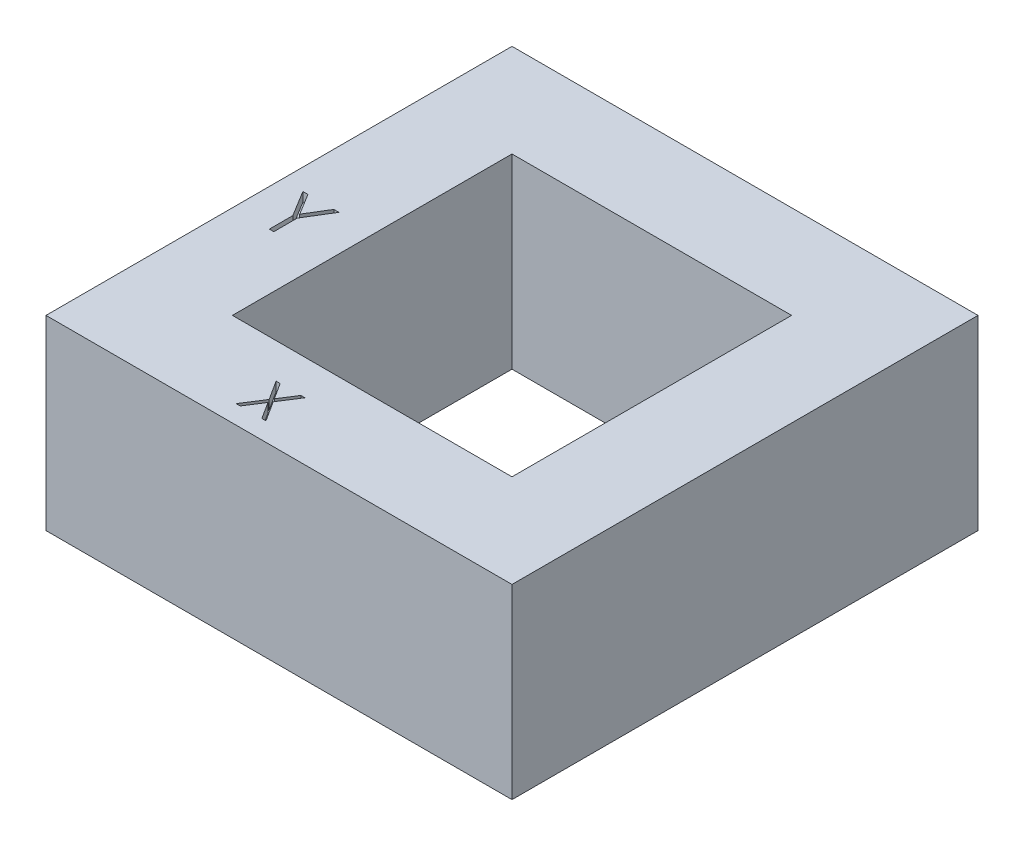
ISO-10303-21;
HEADER;
FILE_DESCRIPTION(('STEP AP214'),'2;1');
FILE_NAME('part.step','',(''),(''),'','','');
FILE_SCHEMA(('AUTOMOTIVE_DESIGN { 1 0 10303 214 1 1 1 1 }'));
ENDSEC;
DATA;
#1=APPLICATION_CONTEXT('core data for automotive mechanical design processes');
#2=APPLICATION_PROTOCOL_DEFINITION('international standard','automotive_design',2000,#1);
#3=PRODUCT_CONTEXT('',#1,'mechanical');
#4=PRODUCT('Part','Part','',(#3));
#5=PRODUCT_RELATED_PRODUCT_CATEGORY('part','',(#4));
#6=PRODUCT_DEFINITION_FORMATION('','',#4);
#7=PRODUCT_DEFINITION_CONTEXT('part definition',#1,'design');
#8=PRODUCT_DEFINITION('design','',#6,#7);
#9=PRODUCT_DEFINITION_SHAPE('','',#8);
#10=(LENGTH_UNIT() NAMED_UNIT(*) SI_UNIT(.MILLI.,.METRE.));
#11=(NAMED_UNIT(*) PLANE_ANGLE_UNIT() SI_UNIT($,.RADIAN.));
#12=(NAMED_UNIT(*) SI_UNIT($,.STERADIAN.) SOLID_ANGLE_UNIT());
#13=UNCERTAINTY_MEASURE_WITH_UNIT(LENGTH_MEASURE(1.E-05),#10,'distance_accuracy_value','');
#14=(GEOMETRIC_REPRESENTATION_CONTEXT(3) GLOBAL_UNCERTAINTY_ASSIGNED_CONTEXT((#13)) GLOBAL_UNIT_ASSIGNED_CONTEXT((#10,
#11,#12)) REPRESENTATION_CONTEXT('',''));
#15=CARTESIAN_POINT('',(0.,0.,0.));
#16=DIRECTION('',(0.,0.,1.));
#17=DIRECTION('',(1.,0.,0.));
#18=AXIS2_PLACEMENT_3D('',#15,#16,#17);
#19=CARTESIAN_POINT('',(0.,10.,0.));
#20=DIRECTION('',(0.,-1.,0.));
#21=DIRECTION('',(0.,0.,-1.));
#22=AXIS2_PLACEMENT_3D('',#19,#20,#21);
#23=PLANE('',#22);
#24=DIRECTION('',(-0.521331386880887,0.,-0.853354313900651));
#25=VECTOR('',#24,1.);
#26=CARTESIAN_POINT('',(-10.5162927350427,10.,1.24227514022436));
#27=LINE('',#26,#25);
#28=CARTESIAN_POINT('',(-10.5162927350427,10.,1.24227514022436));
#29=VERTEX_POINT('',#28);
#30=CARTESIAN_POINT('',(-11.3643162393162,10.,-0.145833333333329));
#31=VERTEX_POINT('',#30);
#32=EDGE_CURVE('E56',#29,#31,#27,.T.);
#33=ORIENTED_EDGE('',*,*,#32,.T.);
#34=DIRECTION('',(1.,0.,0.));
#35=VECTOR('',#34,1.);
#36=CARTESIAN_POINT('',(-11.3643162393162,10.,-0.145833333333329));
#37=LINE('',#36,#35);
#38=CARTESIAN_POINT('',(-11.0924187032585,10.,-0.145833333333329));
#39=VERTEX_POINT('',#38);
#40=EDGE_CURVE('E279',#31,#39,#37,.T.);
#41=ORIENTED_EDGE('',*,*,#40,.T.);
#42=DIRECTION('',(0.521787793651245,0.,0.853075318126463));
#43=VECTOR('',#42,1.);
#44=CARTESIAN_POINT('',(-11.0924187032585,10.,-0.145833333333329));
#45=LINE('',#44,#43);
#46=CARTESIAN_POINT('',(-10.3970394297543,10.,0.991048177083337));
#47=VERTEX_POINT('',#46);
#48=EDGE_CURVE('E282',#39,#47,#45,.T.);
#49=ORIENTED_EDGE('',*,*,#48,.T.);
#50=DIRECTION('',(0.521208584832579,0.,-0.853429324019757));
#51=VECTOR('',#50,1.);
#52=CARTESIAN_POINT('',(-10.3970394297543,10.,0.991048177083337));
#53=LINE('',#52,#51);
#54=CARTESIAN_POINT('',(-9.70272018563034,10.,-0.145833333333329));
#55=VERTEX_POINT('',#54);
#56=EDGE_CURVE('E285',#47,#55,#53,.T.);
#57=ORIENTED_EDGE('',*,*,#56,.T.);
#58=DIRECTION('',(1.,0.,0.));
#59=VECTOR('',#58,1.);
#60=CARTESIAN_POINT('',(-9.70272018563034,10.,-0.145833333333329));
#61=LINE('',#60,#59);
#62=CARTESIAN_POINT('',(-9.43082264957265,10.,-0.145833333333329));
#63=VERTEX_POINT('',#62);
#64=EDGE_CURVE('E288',#55,#63,#61,.T.);
#65=ORIENTED_EDGE('',*,*,#64,.T.);
#66=DIRECTION('',(-0.521331386880887,0.,0.853354313900651));
#67=VECTOR('',#66,1.);
#68=CARTESIAN_POINT('',(-9.43082264957265,10.,-0.145833333333329));
#69=LINE('',#68,#67);
#70=CARTESIAN_POINT('',(-10.2788461538462,10.,1.24227514022436));
#71=VERTEX_POINT('',#70);
#72=EDGE_CURVE('E291',#63,#71,#69,.T.);
#73=ORIENTED_EDGE('',*,*,#72,.T.);
#74=DIRECTION('',(0.,0.,1.));
#75=VECTOR('',#74,1.);
#76=CARTESIAN_POINT('',(-10.2788461538462,10.,1.24227514022436));
#77=LINE('',#76,#75);
#78=CARTESIAN_POINT('',(-10.2788461538462,10.,2.5));
#79=VERTEX_POINT('',#78);
#80=EDGE_CURVE('E294',#71,#79,#77,.T.);
#81=ORIENTED_EDGE('',*,*,#80,.T.);
#82=DIRECTION('',(-1.,0.,0.));
#83=VECTOR('',#82,1.);
#84=CARTESIAN_POINT('',(-10.2788461538462,10.,2.5));
#85=LINE('',#84,#83);
#86=CARTESIAN_POINT('',(-10.5162927350427,10.,2.5));
#87=VERTEX_POINT('',#86);
#88=EDGE_CURVE('E297',#79,#87,#85,.T.);
#89=ORIENTED_EDGE('',*,*,#88,.T.);
#90=DIRECTION('',(0.,0.,-1.));
#91=VECTOR('',#90,1.);
#92=CARTESIAN_POINT('',(-10.5162927350427,10.,2.5));
#93=LINE('',#92,#91);
#94=EDGE_CURVE('E261',#87,#29,#93,.T.);
#95=ORIENTED_EDGE('',*,*,#94,.T.);
#96=EDGE_LOOP('',(#33,#41,#49,#57,#65,#73,#81,#89,#95));
#97=FACE_BOUND('',#96,.T.);
#98=DIRECTION('',(0.,0.,-1.));
#99=VECTOR('',#98,1.);
#100=CARTESIAN_POINT('',(12.5,10.,12.5));
#101=LINE('',#100,#99);
#102=CARTESIAN_POINT('',(12.5,10.,12.5));
#103=VERTEX_POINT('',#102);
#104=CARTESIAN_POINT('',(12.5,10.,-12.5));
#105=VERTEX_POINT('',#104);
#106=EDGE_CURVE('E347',#103,#105,#101,.T.);
#107=ORIENTED_EDGE('',*,*,#106,.T.);
#108=DIRECTION('',(-1.,0.,0.));
#109=VECTOR('',#108,1.);
#110=CARTESIAN_POINT('',(-12.5,10.,-12.5));
#111=LINE('',#110,#109);
#112=CARTESIAN_POINT('',(-12.5,10.,-12.5));
#113=VERTEX_POINT('',#112);
#114=EDGE_CURVE('E350',#105,#113,#111,.T.);
#115=ORIENTED_EDGE('',*,*,#114,.T.);
#116=DIRECTION('',(0.,0.,1.));
#117=VECTOR('',#116,1.);
#118=CARTESIAN_POINT('',(-12.5,10.,12.5));
#119=LINE('',#118,#117);
#120=CARTESIAN_POINT('',(-12.5,10.,12.5));
#121=VERTEX_POINT('',#120);
#122=EDGE_CURVE('E353',#113,#121,#119,.T.);
#123=ORIENTED_EDGE('',*,*,#122,.T.);
#124=DIRECTION('',(1.,0.,0.));
#125=VECTOR('',#124,1.);
#126=CARTESIAN_POINT('',(-12.5,10.,12.5));
#127=LINE('',#126,#125);
#128=EDGE_CURVE('E355',#121,#103,#127,.T.);
#129=ORIENTED_EDGE('',*,*,#128,.T.);
#130=EDGE_LOOP('',(#107,#115,#123,#129));
#131=FACE_BOUND('',#130,.T.);
#132=DIRECTION('',(0.,0.,-1.));
#133=VECTOR('',#132,1.);
#134=CARTESIAN_POINT('',(7.5,10.,7.5));
#135=LINE('',#134,#133);
#136=CARTESIAN_POINT('',(7.5,10.,7.5));
#137=VERTEX_POINT('',#136);
#138=CARTESIAN_POINT('',(7.5,10.,-7.5));
#139=VERTEX_POINT('',#138);
#140=EDGE_CURVE('E319',#137,#139,#135,.T.);
#141=ORIENTED_EDGE('',*,*,#140,.F.);
#142=DIRECTION('',(1.,0.,0.));
#143=VECTOR('',#142,1.);
#144=CARTESIAN_POINT('',(-7.5,10.,7.5));
#145=LINE('',#144,#143);
#146=CARTESIAN_POINT('',(-7.5,10.,7.5));
#147=VERTEX_POINT('',#146);
#148=EDGE_CURVE('E327',#147,#137,#145,.T.);
#149=ORIENTED_EDGE('',*,*,#148,.F.);
#150=DIRECTION('',(0.,0.,1.));
#151=VECTOR('',#150,1.);
#152=CARTESIAN_POINT('',(-7.5,10.,7.5));
#153=LINE('',#152,#151);
#154=CARTESIAN_POINT('',(-7.5,10.,-7.5));
#155=VERTEX_POINT('',#154);
#156=EDGE_CURVE('E324',#155,#147,#153,.T.);
#157=ORIENTED_EDGE('',*,*,#156,.F.);
#158=DIRECTION('',(-1.,0.,0.));
#159=VECTOR('',#158,1.);
#160=CARTESIAN_POINT('',(-7.5,10.,-7.5));
#161=LINE('',#160,#159);
#162=EDGE_CURVE('E321',#139,#155,#161,.T.);
#163=ORIENTED_EDGE('',*,*,#162,.F.);
#164=EDGE_LOOP('',(#141,#149,#157,#163));
#165=FACE_BOUND('',#164,.T.);
#166=DIRECTION('',(-0.539190475611024,0.,-0.842183846324754));
#167=VECTOR('',#166,1.);
#168=CARTESIAN_POINT('',(-2.60939503205128,10.,10.4204660790598));
#169=LINE('',#168,#167);
#170=CARTESIAN_POINT('',(-2.60939503205128,10.,10.4204660790598));
#171=VERTEX_POINT('',#170);
#172=CARTESIAN_POINT('',(-3.27339743589744,10.,9.38333333333334));
#173=VERTEX_POINT('',#172);
#174=EDGE_CURVE('E48',#171,#173,#169,.T.);
#175=ORIENTED_EDGE('',*,*,#174,.T.);
#176=DIRECTION('',(1.,0.,0.));
#177=VECTOR('',#176,1.);
#178=CARTESIAN_POINT('',(-3.27339743589744,10.,9.38333333333334));
#179=LINE('',#178,#177);
#180=CARTESIAN_POINT('',(-3.05418336004274,10.,9.38333333333334));
#181=VERTEX_POINT('',#180);
#182=EDGE_CURVE('E246',#173,#181,#179,.T.);
#183=ORIENTED_EDGE('',*,*,#182,.T.);
#184=DIRECTION('',(0.539088809128561,0.,0.842248927498486));
#185=VECTOR('',#184,1.);
#186=CARTESIAN_POINT('',(-3.05418336004274,10.,9.38333333333334));
#187=LINE('',#186,#185);
#188=CARTESIAN_POINT('',(-2.5,10.,10.2491653311966));
#189=VERTEX_POINT('',#188);
#190=EDGE_CURVE('E438',#181,#189,#187,.T.);
#191=ORIENTED_EDGE('',*,*,#190,.T.);
#192=DIRECTION('',(0.539088809128561,0.,-0.842248927498486));
#193=VECTOR('',#192,1.);
#194=CARTESIAN_POINT('',(-2.5,10.,10.2491653311966));
#195=LINE('',#194,#193);
#196=CARTESIAN_POINT('',(-1.94581663995727,10.,9.38333333333334));
#197=VERTEX_POINT('',#196);
#198=EDGE_CURVE('E445',#189,#197,#195,.T.);
#199=ORIENTED_EDGE('',*,*,#198,.T.);
#200=DIRECTION('',(1.,0.,0.));
#201=VECTOR('',#200,1.);
#202=CARTESIAN_POINT('',(-1.94581663995727,10.,9.38333333333334));
#203=LINE('',#202,#201);
#204=CARTESIAN_POINT('',(-1.72660256410257,10.,9.38333333333334));
#205=VERTEX_POINT('',#204);
#206=EDGE_CURVE('E448',#197,#205,#203,.T.);
#207=ORIENTED_EDGE('',*,*,#206,.T.);
#208=DIRECTION('',(-0.538946197134426,0.,0.842340190537256));
#209=VECTOR('',#208,1.);
#210=CARTESIAN_POINT('',(-1.72660256410257,10.,9.38333333333334));
#211=LINE('',#210,#209);
#212=CARTESIAN_POINT('',(-2.39018095619658,10.,10.4204660790598));
#213=VERTEX_POINT('',#212);
#214=EDGE_CURVE('E451',#205,#213,#211,.T.);
#215=ORIENTED_EDGE('',*,*,#214,.T.);
#216=DIRECTION('',(0.538950419912938,0.,0.842337488703707));
#217=VECTOR('',#216,1.);
#218=CARTESIAN_POINT('',(-2.39018095619658,10.,10.4204660790598));
#219=LINE('',#218,#217);
#220=CARTESIAN_POINT('',(-1.69946581196582,10.,11.5));
#221=VERTEX_POINT('',#220);
#222=EDGE_CURVE('E454',#213,#221,#219,.T.);
#223=ORIENTED_EDGE('',*,*,#222,.T.);
#224=DIRECTION('',(-1.,0.,0.));
#225=VECTOR('',#224,1.);
#226=CARTESIAN_POINT('',(-1.69946581196582,10.,11.5));
#227=LINE('',#226,#225);
#228=CARTESIAN_POINT('',(-1.91867988782052,10.,11.5));
#229=VERTEX_POINT('',#228);
#230=EDGE_CURVE('E457',#221,#229,#227,.T.);
#231=ORIENTED_EDGE('',*,*,#230,.T.);
#232=DIRECTION('',(-0.539087169942497,0.,-0.842249976671647));
#233=VECTOR('',#232,1.);
#234=CARTESIAN_POINT('',(-1.91867988782052,10.,11.5));
#235=LINE('',#234,#233);
#236=CARTESIAN_POINT('',(-2.5,10.,10.5917668269231));
#237=VERTEX_POINT('',#236);
#238=EDGE_CURVE('E460',#229,#237,#235,.T.);
#239=ORIENTED_EDGE('',*,*,#238,.T.);
#240=DIRECTION('',(-0.539087169942497,0.,0.842249976671647));
#241=VECTOR('',#240,1.);
#242=CARTESIAN_POINT('',(-2.5,10.,10.5917668269231));
#243=LINE('',#242,#241);
#244=CARTESIAN_POINT('',(-3.08132011217949,10.,11.5));
#245=VERTEX_POINT('',#244);
#246=EDGE_CURVE('E463',#237,#245,#243,.T.);
#247=ORIENTED_EDGE('',*,*,#246,.T.);
#248=DIRECTION('',(-1.,0.,0.));
#249=VECTOR('',#248,1.);
#250=CARTESIAN_POINT('',(-3.08132011217949,10.,11.5));
#251=LINE('',#250,#249);
#252=CARTESIAN_POINT('',(-3.30053418803419,10.,11.5));
#253=VERTEX_POINT('',#252);
#254=EDGE_CURVE('E466',#245,#253,#251,.T.);
#255=ORIENTED_EDGE('',*,*,#254,.T.);
#256=DIRECTION('',(0.539185104098949,0.,-0.842187285298113));
#257=VECTOR('',#256,1.);
#258=CARTESIAN_POINT('',(-3.30053418803419,10.,11.5));
#259=LINE('',#258,#257);
#260=EDGE_CURVE('E242',#253,#171,#259,.T.);
#261=ORIENTED_EDGE('',*,*,#260,.T.);
#262=EDGE_LOOP('',(#175,#183,#191,#199,#207,#215,#223,#231,#239,#247,#255,#261));
#263=FACE_BOUND('',#262,.T.);
#264=ADVANCED_FACE('F33',(#97,#131,#165,#263),#23,.F.);
#265=CARTESIAN_POINT('',(0.,0.,0.));
#266=DIRECTION('',(0.,-1.,0.));
#267=DIRECTION('',(0.,0.,-1.));
#268=AXIS2_PLACEMENT_3D('',#265,#266,#267);
#269=PLANE('',#268);
#270=DIRECTION('',(0.,0.,-1.));
#271=VECTOR('',#270,1.);
#272=CARTESIAN_POINT('',(12.5,0.,12.5));
#273=LINE('',#272,#271);
#274=CARTESIAN_POINT('',(12.5,0.,12.5));
#275=VERTEX_POINT('',#274);
#276=CARTESIAN_POINT('',(12.5,0.,-12.5));
#277=VERTEX_POINT('',#276);
#278=EDGE_CURVE('E346',#275,#277,#273,.T.);
#279=ORIENTED_EDGE('',*,*,#278,.F.);
#280=DIRECTION('',(1.,0.,0.));
#281=VECTOR('',#280,1.);
#282=CARTESIAN_POINT('',(-12.5,0.,12.5));
#283=LINE('',#282,#281);
#284=CARTESIAN_POINT('',(-12.5,0.,12.5));
#285=VERTEX_POINT('',#284);
#286=EDGE_CURVE('E351',#285,#275,#283,.T.);
#287=ORIENTED_EDGE('',*,*,#286,.F.);
#288=DIRECTION('',(0.,0.,1.));
#289=VECTOR('',#288,1.);
#290=CARTESIAN_POINT('',(-12.5,0.,12.5));
#291=LINE('',#290,#289);
#292=CARTESIAN_POINT('',(-12.5,0.,-12.5));
#293=VERTEX_POINT('',#292);
#294=EDGE_CURVE('E362',#293,#285,#291,.T.);
#295=ORIENTED_EDGE('',*,*,#294,.F.);
#296=DIRECTION('',(-1.,0.,0.));
#297=VECTOR('',#296,1.);
#298=CARTESIAN_POINT('',(-12.5,0.,-12.5));
#299=LINE('',#298,#297);
#300=EDGE_CURVE('E360',#277,#293,#299,.T.);
#301=ORIENTED_EDGE('',*,*,#300,.F.);
#302=EDGE_LOOP('',(#279,#287,#295,#301));
#303=FACE_BOUND('',#302,.T.);
#304=DIRECTION('',(1.,0.,0.));
#305=VECTOR('',#304,1.);
#306=CARTESIAN_POINT('',(-7.5,0.,7.5));
#307=LINE('',#306,#305);
#308=CARTESIAN_POINT('',(-7.5,0.,7.5));
#309=VERTEX_POINT('',#308);
#310=CARTESIAN_POINT('',(7.5,0.,7.5));
#311=VERTEX_POINT('',#310);
#312=EDGE_CURVE('E322',#309,#311,#307,.T.);
#313=ORIENTED_EDGE('',*,*,#312,.T.);
#314=DIRECTION('',(0.,0.,-1.));
#315=VECTOR('',#314,1.);
#316=CARTESIAN_POINT('',(7.5,0.,7.5));
#317=LINE('',#316,#315);
#318=CARTESIAN_POINT('',(7.5,0.,-7.5));
#319=VERTEX_POINT('',#318);
#320=EDGE_CURVE('E247',#311,#319,#317,.T.);
#321=ORIENTED_EDGE('',*,*,#320,.T.);
#322=DIRECTION('',(-1.,0.,0.));
#323=VECTOR('',#322,1.);
#324=CARTESIAN_POINT('',(-7.5,0.,-7.5));
#325=LINE('',#324,#323);
#326=CARTESIAN_POINT('',(-7.5,0.,-7.5));
#327=VERTEX_POINT('',#326);
#328=EDGE_CURVE('E251',#319,#327,#325,.T.);
#329=ORIENTED_EDGE('',*,*,#328,.T.);
#330=DIRECTION('',(0.,0.,1.));
#331=VECTOR('',#330,1.);
#332=CARTESIAN_POINT('',(-7.5,0.,7.5));
#333=LINE('',#332,#331);
#334=EDGE_CURVE('E332',#327,#309,#333,.T.);
#335=ORIENTED_EDGE('',*,*,#334,.T.);
#336=EDGE_LOOP('',(#313,#321,#329,#335));
#337=FACE_BOUND('',#336,.T.);
#338=ADVANCED_FACE('F380',(#303,#337),#269,.T.);
#339=CARTESIAN_POINT('',(12.5,10.,12.5));
#340=DIRECTION('',(-1.,0.,0.));
#341=DIRECTION('',(0.,0.,1.));
#342=AXIS2_PLACEMENT_3D('',#339,#340,#341);
#343=PLANE('',#342);
#344=ORIENTED_EDGE('',*,*,#278,.T.);
#345=DIRECTION('',(0.,-1.,0.));
#346=VECTOR('',#345,1.);
#347=CARTESIAN_POINT('',(12.5,10.,-12.5));
#348=LINE('',#347,#346);
#349=EDGE_CURVE('E11',#105,#277,#348,.T.);
#350=ORIENTED_EDGE('',*,*,#349,.F.);
#351=ORIENTED_EDGE('',*,*,#106,.F.);
#352=DIRECTION('',(0.,-1.,0.));
#353=VECTOR('',#352,1.);
#354=CARTESIAN_POINT('',(12.5,10.,12.5));
#355=LINE('',#354,#353);
#356=EDGE_CURVE('E357',#103,#275,#355,.T.);
#357=ORIENTED_EDGE('',*,*,#356,.T.);
#358=EDGE_LOOP('',(#344,#350,#351,#357));
#359=FACE_BOUND('',#358,.T.);
#360=ADVANCED_FACE('F35',(#359),#343,.F.);
#361=CARTESIAN_POINT('',(-12.5,10.,-12.5));
#362=DIRECTION('',(0.,0.,1.));
#363=DIRECTION('',(1.,0.,0.));
#364=AXIS2_PLACEMENT_3D('',#361,#362,#363);
#365=PLANE('',#364);
#366=ORIENTED_EDGE('',*,*,#300,.T.);
#367=DIRECTION('',(0.,-1.,0.));
#368=VECTOR('',#367,1.);
#369=CARTESIAN_POINT('',(-12.5,10.,-12.5));
#370=LINE('',#369,#368);
#371=EDGE_CURVE('E41',#113,#293,#370,.T.);
#372=ORIENTED_EDGE('',*,*,#371,.F.);
#373=ORIENTED_EDGE('',*,*,#114,.F.);
#374=ORIENTED_EDGE('',*,*,#349,.T.);
#375=EDGE_LOOP('',(#366,#372,#373,#374));
#376=FACE_BOUND('',#375,.T.);
#377=ADVANCED_FACE('F391',(#376),#365,.F.);
#378=CARTESIAN_POINT('',(-12.5,10.,12.5));
#379=DIRECTION('',(1.,0.,0.));
#380=DIRECTION('',(0.,0.,-1.));
#381=AXIS2_PLACEMENT_3D('',#378,#379,#380);
#382=PLANE('',#381);
#383=ORIENTED_EDGE('',*,*,#294,.T.);
#384=DIRECTION('',(0.,-1.,0.));
#385=VECTOR('',#384,1.);
#386=CARTESIAN_POINT('',(-12.5,10.,12.5));
#387=LINE('',#386,#385);
#388=EDGE_CURVE('E367',#121,#285,#387,.T.);
#389=ORIENTED_EDGE('',*,*,#388,.F.);
#390=ORIENTED_EDGE('',*,*,#122,.F.);
#391=ORIENTED_EDGE('',*,*,#371,.T.);
#392=EDGE_LOOP('',(#383,#389,#390,#391));
#393=FACE_BOUND('',#392,.T.);
#394=ADVANCED_FACE('F374',(#393),#382,.F.);
#395=CARTESIAN_POINT('',(-12.5,10.,12.5));
#396=DIRECTION('',(0.,0.,-1.));
#397=DIRECTION('',(-1.,0.,0.));
#398=AXIS2_PLACEMENT_3D('',#395,#396,#397);
#399=PLANE('',#398);
#400=ORIENTED_EDGE('',*,*,#286,.T.);
#401=ORIENTED_EDGE('',*,*,#356,.F.);
#402=ORIENTED_EDGE('',*,*,#128,.F.);
#403=ORIENTED_EDGE('',*,*,#388,.T.);
#404=EDGE_LOOP('',(#400,#401,#402,#403));
#405=FACE_BOUND('',#404,.T.);
#406=ADVANCED_FACE('F384',(#405),#399,.F.);
#407=CARTESIAN_POINT('',(7.5,10.,7.5));
#408=DIRECTION('',(-1.,0.,0.));
#409=DIRECTION('',(0.,0.,1.));
#410=AXIS2_PLACEMENT_3D('',#407,#408,#409);
#411=PLANE('',#410);
#412=ORIENTED_EDGE('',*,*,#320,.F.);
#413=DIRECTION('',(0.,-1.,0.));
#414=VECTOR('',#413,1.);
#415=CARTESIAN_POINT('',(7.5,10.,7.5));
#416=LINE('',#415,#414);
#417=EDGE_CURVE('E328',#137,#311,#416,.T.);
#418=ORIENTED_EDGE('',*,*,#417,.F.);
#419=ORIENTED_EDGE('',*,*,#140,.T.);
#420=DIRECTION('',(0.,-1.,0.));
#421=VECTOR('',#420,1.);
#422=CARTESIAN_POINT('',(7.5,10.,-7.5));
#423=LINE('',#422,#421);
#424=EDGE_CURVE('E343',#139,#319,#423,.T.);
#425=ORIENTED_EDGE('',*,*,#424,.T.);
#426=EDGE_LOOP('',(#412,#418,#419,#425));
#427=FACE_BOUND('',#426,.T.);
#428=ADVANCED_FACE('F406',(#427),#411,.T.);
#429=CARTESIAN_POINT('',(-7.5,10.,-7.5));
#430=DIRECTION('',(0.,0.,1.));
#431=DIRECTION('',(1.,0.,0.));
#432=AXIS2_PLACEMENT_3D('',#429,#430,#431);
#433=PLANE('',#432);
#434=ORIENTED_EDGE('',*,*,#328,.F.);
#435=ORIENTED_EDGE('',*,*,#424,.F.);
#436=ORIENTED_EDGE('',*,*,#162,.T.);
#437=DIRECTION('',(0.,-1.,0.));
#438=VECTOR('',#437,1.);
#439=CARTESIAN_POINT('',(-7.5,10.,-7.5));
#440=LINE('',#439,#438);
#441=EDGE_CURVE('E341',#155,#327,#440,.T.);
#442=ORIENTED_EDGE('',*,*,#441,.T.);
#443=EDGE_LOOP('',(#434,#435,#436,#442));
#444=FACE_BOUND('',#443,.T.);
#445=ADVANCED_FACE('F413',(#444),#433,.T.);
#446=CARTESIAN_POINT('',(-7.5,10.,7.5));
#447=DIRECTION('',(1.,0.,0.));
#448=DIRECTION('',(0.,0.,-1.));
#449=AXIS2_PLACEMENT_3D('',#446,#447,#448);
#450=PLANE('',#449);
#451=ORIENTED_EDGE('',*,*,#334,.F.);
#452=ORIENTED_EDGE('',*,*,#441,.F.);
#453=ORIENTED_EDGE('',*,*,#156,.T.);
#454=DIRECTION('',(0.,-1.,0.));
#455=VECTOR('',#454,1.);
#456=CARTESIAN_POINT('',(-7.5,10.,7.5));
#457=LINE('',#456,#455);
#458=EDGE_CURVE('E339',#147,#309,#457,.T.);
#459=ORIENTED_EDGE('',*,*,#458,.T.);
#460=EDGE_LOOP('',(#451,#452,#453,#459));
#461=FACE_BOUND('',#460,.T.);
#462=ADVANCED_FACE('F418',(#461),#450,.T.);
#463=CARTESIAN_POINT('',(-7.5,10.,7.5));
#464=DIRECTION('',(0.,0.,-1.));
#465=DIRECTION('',(-1.,0.,0.));
#466=AXIS2_PLACEMENT_3D('',#463,#464,#465);
#467=PLANE('',#466);
#468=ORIENTED_EDGE('',*,*,#312,.F.);
#469=ORIENTED_EDGE('',*,*,#458,.F.);
#470=ORIENTED_EDGE('',*,*,#148,.T.);
#471=ORIENTED_EDGE('',*,*,#417,.T.);
#472=EDGE_LOOP('',(#468,#469,#470,#471));
#473=FACE_BOUND('',#472,.T.);
#474=ADVANCED_FACE('F425',(#473),#467,.T.);
#475=CARTESIAN_POINT('',(-10.5162927350427,9.5,1.24227514022436));
#476=DIRECTION('',(0.853354313900651,0.,-0.521331386880887));
#477=DIRECTION('',(-0.521331386880887,0.,-0.853354313900651));
#478=AXIS2_PLACEMENT_3D('',#475,#476,#477);
#479=PLANE('',#478);
#480=ORIENTED_EDGE('',*,*,#32,.F.);
#481=DIRECTION('',(0.,1.,0.));
#482=VECTOR('',#481,1.);
#483=CARTESIAN_POINT('',(-10.5162927350427,9.5,1.24227514022436));
#484=LINE('',#483,#482);
#485=CARTESIAN_POINT('',(-10.5162927350427,9.5,1.24227514022436));
#486=VERTEX_POINT('',#485);
#487=EDGE_CURVE('E277',#486,#29,#484,.T.);
#488=ORIENTED_EDGE('',*,*,#487,.F.);
#489=DIRECTION('',(-0.521331386880887,0.,-0.853354313900651));
#490=VECTOR('',#489,1.);
#491=CARTESIAN_POINT('',(-10.5162927350427,9.5,1.24227514022436));
#492=LINE('',#491,#490);
#493=CARTESIAN_POINT('',(-11.3643162393162,9.5,-0.145833333333329));
#494=VERTEX_POINT('',#493);
#495=EDGE_CURVE('E257',#486,#494,#492,.T.);
#496=ORIENTED_EDGE('',*,*,#495,.T.);
#497=DIRECTION('',(0.,1.,0.));
#498=VECTOR('',#497,1.);
#499=CARTESIAN_POINT('',(-11.3643162393162,9.5,-0.145833333333329));
#500=LINE('',#499,#498);
#501=EDGE_CURVE('E317',#494,#31,#500,.T.);
#502=ORIENTED_EDGE('',*,*,#501,.T.);
#503=EDGE_LOOP('',(#480,#488,#496,#502));
#504=FACE_BOUND('',#503,.T.);
#505=ADVANCED_FACE('F610',(#504),#479,.T.);
#506=CARTESIAN_POINT('',(-11.3643162393162,9.5,-0.145833333333329));
#507=DIRECTION('',(0.,0.,1.));
#508=DIRECTION('',(1.,0.,0.));
#509=AXIS2_PLACEMENT_3D('',#506,#507,#508);
#510=PLANE('',#509);
#511=ORIENTED_EDGE('',*,*,#40,.F.);
#512=ORIENTED_EDGE('',*,*,#501,.F.);
#513=DIRECTION('',(1.,0.,0.));
#514=VECTOR('',#513,1.);
#515=CARTESIAN_POINT('',(-11.3643162393162,9.5,-0.145833333333329));
#516=LINE('',#515,#514);
#517=CARTESIAN_POINT('',(-11.0924187032585,9.5,-0.145833333333329));
#518=VERTEX_POINT('',#517);
#519=EDGE_CURVE('E260',#494,#518,#516,.T.);
#520=ORIENTED_EDGE('',*,*,#519,.T.);
#521=DIRECTION('',(0.,1.,0.));
#522=VECTOR('',#521,1.);
#523=CARTESIAN_POINT('',(-11.0924187032585,9.5,-0.145833333333329));
#524=LINE('',#523,#522);
#525=EDGE_CURVE('E315',#518,#39,#524,.T.);
#526=ORIENTED_EDGE('',*,*,#525,.T.);
#527=EDGE_LOOP('',(#511,#512,#520,#526));
#528=FACE_BOUND('',#527,.T.);
#529=ADVANCED_FACE('F606',(#528),#510,.T.);
#530=CARTESIAN_POINT('',(-11.0924187032585,9.5,-0.145833333333329));
#531=DIRECTION('',(-0.853075318126463,0.,0.521787793651245));
#532=DIRECTION('',(0.521787793651245,0.,0.853075318126463));
#533=AXIS2_PLACEMENT_3D('',#530,#531,#532);
#534=PLANE('',#533);
#535=ORIENTED_EDGE('',*,*,#48,.F.);
#536=ORIENTED_EDGE('',*,*,#525,.F.);
#537=DIRECTION('',(0.521787793651245,0.,0.853075318126463));
#538=VECTOR('',#537,1.);
#539=CARTESIAN_POINT('',(-11.0924187032585,9.5,-0.145833333333329));
#540=LINE('',#539,#538);
#541=CARTESIAN_POINT('',(-10.3970394297543,9.5,0.991048177083337));
#542=VERTEX_POINT('',#541);
#543=EDGE_CURVE('E263',#518,#542,#540,.T.);
#544=ORIENTED_EDGE('',*,*,#543,.T.);
#545=DIRECTION('',(0.,1.,0.));
#546=VECTOR('',#545,1.);
#547=CARTESIAN_POINT('',(-10.3970394297543,9.5,0.991048177083337));
#548=LINE('',#547,#546);
#549=EDGE_CURVE('E313',#542,#47,#548,.T.);
#550=ORIENTED_EDGE('',*,*,#549,.T.);
#551=EDGE_LOOP('',(#535,#536,#544,#550));
#552=FACE_BOUND('',#551,.T.);
#553=ADVANCED_FACE('F602',(#552),#534,.T.);
#554=CARTESIAN_POINT('',(-10.3970394297543,9.5,0.991048177083337));
#555=DIRECTION('',(0.853429324019757,0.,0.521208584832579));
#556=DIRECTION('',(0.521208584832579,0.,-0.853429324019758));
#557=AXIS2_PLACEMENT_3D('',#554,#555,#556);
#558=PLANE('',#557);
#559=ORIENTED_EDGE('',*,*,#56,.F.);
#560=ORIENTED_EDGE('',*,*,#549,.F.);
#561=DIRECTION('',(0.521208584832579,0.,-0.853429324019757));
#562=VECTOR('',#561,1.);
#563=CARTESIAN_POINT('',(-10.3970394297543,9.5,0.991048177083337));
#564=LINE('',#563,#562);
#565=CARTESIAN_POINT('',(-9.70272018563034,9.5,-0.145833333333329));
#566=VERTEX_POINT('',#565);
#567=EDGE_CURVE('E265',#542,#566,#564,.T.);
#568=ORIENTED_EDGE('',*,*,#567,.T.);
#569=DIRECTION('',(0.,1.,0.));
#570=VECTOR('',#569,1.);
#571=CARTESIAN_POINT('',(-9.70272018563034,9.5,-0.145833333333329));
#572=LINE('',#571,#570);
#573=EDGE_CURVE('E311',#566,#55,#572,.T.);
#574=ORIENTED_EDGE('',*,*,#573,.T.);
#575=EDGE_LOOP('',(#559,#560,#568,#574));
#576=FACE_BOUND('',#575,.T.);
#577=ADVANCED_FACE('F598',(#576),#558,.T.);
#578=CARTESIAN_POINT('',(-9.70272018563034,9.5,-0.145833333333329));
#579=DIRECTION('',(0.,0.,1.));
#580=DIRECTION('',(1.,0.,0.));
#581=AXIS2_PLACEMENT_3D('',#578,#579,#580);
#582=PLANE('',#581);
#583=ORIENTED_EDGE('',*,*,#64,.F.);
#584=ORIENTED_EDGE('',*,*,#573,.F.);
#585=DIRECTION('',(1.,0.,0.));
#586=VECTOR('',#585,1.);
#587=CARTESIAN_POINT('',(-9.70272018563034,9.5,-0.145833333333329));
#588=LINE('',#587,#586);
#589=CARTESIAN_POINT('',(-9.43082264957265,9.5,-0.145833333333329));
#590=VERTEX_POINT('',#589);
#591=EDGE_CURVE('E267',#566,#590,#588,.T.);
#592=ORIENTED_EDGE('',*,*,#591,.T.);
#593=DIRECTION('',(0.,1.,0.));
#594=VECTOR('',#593,1.);
#595=CARTESIAN_POINT('',(-9.43082264957265,9.5,-0.145833333333329));
#596=LINE('',#595,#594);
#597=EDGE_CURVE('E309',#590,#63,#596,.T.);
#598=ORIENTED_EDGE('',*,*,#597,.T.);
#599=EDGE_LOOP('',(#583,#584,#592,#598));
#600=FACE_BOUND('',#599,.T.);
#601=ADVANCED_FACE('F594',(#600),#582,.T.);
#602=CARTESIAN_POINT('',(-9.43082264957265,9.5,-0.145833333333329));
#603=DIRECTION('',(-0.853354313900651,0.,-0.521331386880887));
#604=DIRECTION('',(-0.521331386880887,0.,0.853354313900651));
#605=AXIS2_PLACEMENT_3D('',#602,#603,#604);
#606=PLANE('',#605);
#607=ORIENTED_EDGE('',*,*,#72,.F.);
#608=ORIENTED_EDGE('',*,*,#597,.F.);
#609=DIRECTION('',(-0.521331386880887,0.,0.853354313900651));
#610=VECTOR('',#609,1.);
#611=CARTESIAN_POINT('',(-9.43082264957265,9.5,-0.145833333333329));
#612=LINE('',#611,#610);
#613=CARTESIAN_POINT('',(-10.2788461538462,9.5,1.24227514022436));
#614=VERTEX_POINT('',#613);
#615=EDGE_CURVE('E269',#590,#614,#612,.T.);
#616=ORIENTED_EDGE('',*,*,#615,.T.);
#617=DIRECTION('',(0.,1.,0.));
#618=VECTOR('',#617,1.);
#619=CARTESIAN_POINT('',(-10.2788461538462,9.5,1.24227514022436));
#620=LINE('',#619,#618);
#621=EDGE_CURVE('E307',#614,#71,#620,.T.);
#622=ORIENTED_EDGE('',*,*,#621,.T.);
#623=EDGE_LOOP('',(#607,#608,#616,#622));
#624=FACE_BOUND('',#623,.T.);
#625=ADVANCED_FACE('F590',(#624),#606,.T.);
#626=CARTESIAN_POINT('',(-10.2788461538462,9.5,1.24227514022436));
#627=DIRECTION('',(-1.,0.,0.));
#628=DIRECTION('',(0.,0.,1.));
#629=AXIS2_PLACEMENT_3D('',#626,#627,#628);
#630=PLANE('',#629);
#631=ORIENTED_EDGE('',*,*,#80,.F.);
#632=ORIENTED_EDGE('',*,*,#621,.F.);
#633=DIRECTION('',(0.,0.,1.));
#634=VECTOR('',#633,1.);
#635=CARTESIAN_POINT('',(-10.2788461538462,9.5,1.24227514022436));
#636=LINE('',#635,#634);
#637=CARTESIAN_POINT('',(-10.2788461538462,9.5,2.5));
#638=VERTEX_POINT('',#637);
#639=EDGE_CURVE('E271',#614,#638,#636,.T.);
#640=ORIENTED_EDGE('',*,*,#639,.T.);
#641=DIRECTION('',(0.,1.,0.));
#642=VECTOR('',#641,1.);
#643=CARTESIAN_POINT('',(-10.2788461538462,9.5,2.5));
#644=LINE('',#643,#642);
#645=EDGE_CURVE('E305',#638,#79,#644,.T.);
#646=ORIENTED_EDGE('',*,*,#645,.T.);
#647=EDGE_LOOP('',(#631,#632,#640,#646));
#648=FACE_BOUND('',#647,.T.);
#649=ADVANCED_FACE('F586',(#648),#630,.T.);
#650=CARTESIAN_POINT('',(-10.2788461538462,9.5,2.5));
#651=DIRECTION('',(0.,0.,-1.));
#652=DIRECTION('',(-1.,0.,0.));
#653=AXIS2_PLACEMENT_3D('',#650,#651,#652);
#654=PLANE('',#653);
#655=ORIENTED_EDGE('',*,*,#88,.F.);
#656=ORIENTED_EDGE('',*,*,#645,.F.);
#657=DIRECTION('',(-1.,0.,0.));
#658=VECTOR('',#657,1.);
#659=CARTESIAN_POINT('',(-10.2788461538462,9.5,2.5));
#660=LINE('',#659,#658);
#661=CARTESIAN_POINT('',(-10.5162927350427,9.5,2.5));
#662=VERTEX_POINT('',#661);
#663=EDGE_CURVE('E273',#638,#662,#660,.T.);
#664=ORIENTED_EDGE('',*,*,#663,.T.);
#665=DIRECTION('',(0.,1.,0.));
#666=VECTOR('',#665,1.);
#667=CARTESIAN_POINT('',(-10.5162927350427,9.5,2.5));
#668=LINE('',#667,#666);
#669=EDGE_CURVE('E303',#662,#87,#668,.T.);
#670=ORIENTED_EDGE('',*,*,#669,.T.);
#671=EDGE_LOOP('',(#655,#656,#664,#670));
#672=FACE_BOUND('',#671,.T.);
#673=ADVANCED_FACE('F582',(#672),#654,.T.);
#674=CARTESIAN_POINT('',(-10.5162927350427,9.5,2.5));
#675=DIRECTION('',(1.,0.,0.));
#676=DIRECTION('',(0.,0.,-1.));
#677=AXIS2_PLACEMENT_3D('',#674,#675,#676);
#678=PLANE('',#677);
#679=ORIENTED_EDGE('',*,*,#94,.F.);
#680=ORIENTED_EDGE('',*,*,#669,.F.);
#681=DIRECTION('',(0.,0.,-1.));
#682=VECTOR('',#681,1.);
#683=CARTESIAN_POINT('',(-10.5162927350427,9.5,2.5));
#684=LINE('',#683,#682);
#685=EDGE_CURVE('E275',#662,#486,#684,.T.);
#686=ORIENTED_EDGE('',*,*,#685,.T.);
#687=ORIENTED_EDGE('',*,*,#487,.T.);
#688=EDGE_LOOP('',(#679,#680,#686,#687));
#689=FACE_BOUND('',#688,.T.);
#690=ADVANCED_FACE('F578',(#689),#678,.T.);
#691=CARTESIAN_POINT('',(0.,9.5,0.));
#692=DIRECTION('',(0.,1.,0.));
#693=DIRECTION('',(0.,0.,1.));
#694=AXIS2_PLACEMENT_3D('',#691,#692,#693);
#695=PLANE('',#694);
#696=ORIENTED_EDGE('',*,*,#495,.F.);
#697=ORIENTED_EDGE('',*,*,#685,.F.);
#698=ORIENTED_EDGE('',*,*,#663,.F.);
#699=ORIENTED_EDGE('',*,*,#639,.F.);
#700=ORIENTED_EDGE('',*,*,#615,.F.);
#701=ORIENTED_EDGE('',*,*,#591,.F.);
#702=ORIENTED_EDGE('',*,*,#567,.F.);
#703=ORIENTED_EDGE('',*,*,#543,.F.);
#704=ORIENTED_EDGE('',*,*,#519,.F.);
#705=EDGE_LOOP('',(#696,#697,#698,#699,#700,#701,#702,#703,#704));
#706=FACE_BOUND('',#705,.T.);
#707=ADVANCED_FACE('F575',(#706),#695,.T.);
#708=CARTESIAN_POINT('',(-2.60939503205128,9.5,10.4204660790598));
#709=DIRECTION('',(0.842183846324755,0.,-0.539190475611024));
#710=DIRECTION('',(-0.539190475611024,0.,-0.842183846324755));
#711=AXIS2_PLACEMENT_3D('',#708,#709,#710);
#712=PLANE('',#711);
#713=ORIENTED_EDGE('',*,*,#174,.F.);
#714=DIRECTION('',(0.,1.,0.));
#715=VECTOR('',#714,1.);
#716=CARTESIAN_POINT('',(-2.60939503205128,9.5,10.4204660790598));
#717=LINE('',#716,#715);
#718=CARTESIAN_POINT('',(-2.60939503205128,9.5,10.4204660790598));
#719=VERTEX_POINT('',#718);
#720=EDGE_CURVE('E241',#719,#171,#717,.T.);
#721=ORIENTED_EDGE('',*,*,#720,.F.);
#722=DIRECTION('',(-0.539190475611024,0.,-0.842183846324754));
#723=VECTOR('',#722,1.);
#724=CARTESIAN_POINT('',(-2.60939503205128,9.5,10.4204660790598));
#725=LINE('',#724,#723);
#726=CARTESIAN_POINT('',(-3.27339743589744,9.5,9.38333333333334));
#727=VERTEX_POINT('',#726);
#728=EDGE_CURVE('E232',#719,#727,#725,.T.);
#729=ORIENTED_EDGE('',*,*,#728,.T.);
#730=DIRECTION('',(0.,1.,0.));
#731=VECTOR('',#730,1.);
#732=CARTESIAN_POINT('',(-3.27339743589744,9.5,9.38333333333334));
#733=LINE('',#732,#731);
#734=EDGE_CURVE('E240',#727,#173,#733,.T.);
#735=ORIENTED_EDGE('',*,*,#734,.T.);
#736=EDGE_LOOP('',(#713,#721,#729,#735));
#737=FACE_BOUND('',#736,.T.);
#738=ADVANCED_FACE('F239',(#737),#712,.T.);
#739=CARTESIAN_POINT('',(-3.27339743589744,9.5,9.38333333333334));
#740=DIRECTION('',(0.,0.,1.));
#741=DIRECTION('',(1.,0.,0.));
#742=AXIS2_PLACEMENT_3D('',#739,#740,#741);
#743=PLANE('',#742);
#744=ORIENTED_EDGE('',*,*,#182,.F.);
#745=ORIENTED_EDGE('',*,*,#734,.F.);
#746=DIRECTION('',(1.,0.,0.));
#747=VECTOR('',#746,1.);
#748=CARTESIAN_POINT('',(-3.27339743589744,9.5,9.38333333333334));
#749=LINE('',#748,#747);
#750=CARTESIAN_POINT('',(-3.05418336004274,9.5,9.38333333333334));
#751=VERTEX_POINT('',#750);
#752=EDGE_CURVE('E228',#727,#751,#749,.T.);
#753=ORIENTED_EDGE('',*,*,#752,.T.);
#754=DIRECTION('',(0.,1.,0.));
#755=VECTOR('',#754,1.);
#756=CARTESIAN_POINT('',(-3.05418336004274,9.5,9.38333333333334));
#757=LINE('',#756,#755);
#758=EDGE_CURVE('E248',#751,#181,#757,.T.);
#759=ORIENTED_EDGE('',*,*,#758,.T.);
#760=EDGE_LOOP('',(#744,#745,#753,#759));
#761=FACE_BOUND('',#760,.T.);
#762=ADVANCED_FACE('F244',(#761),#743,.T.);
#763=CARTESIAN_POINT('',(-3.05418336004274,9.5,9.38333333333334));
#764=DIRECTION('',(-0.842248927498486,0.,0.539088809128561));
#765=DIRECTION('',(0.539088809128561,0.,0.842248927498486));
#766=AXIS2_PLACEMENT_3D('',#763,#764,#765);
#767=PLANE('',#766);
#768=ORIENTED_EDGE('',*,*,#190,.F.);
#769=ORIENTED_EDGE('',*,*,#758,.F.);
#770=DIRECTION('',(0.539088809128561,0.,0.842248927498486));
#771=VECTOR('',#770,1.);
#772=CARTESIAN_POINT('',(-3.05418336004274,9.5,9.38333333333334));
#773=LINE('',#772,#771);
#774=CARTESIAN_POINT('',(-2.5,9.5,10.2491653311966));
#775=VERTEX_POINT('',#774);
#776=EDGE_CURVE('E234',#751,#775,#773,.T.);
#777=ORIENTED_EDGE('',*,*,#776,.T.);
#778=DIRECTION('',(0.,1.,0.));
#779=VECTOR('',#778,1.);
#780=CARTESIAN_POINT('',(-2.5,9.5,10.2491653311966));
#781=LINE('',#780,#779);
#782=EDGE_CURVE('E253',#775,#189,#781,.T.);
#783=ORIENTED_EDGE('',*,*,#782,.T.);
#784=EDGE_LOOP('',(#768,#769,#777,#783));
#785=FACE_BOUND('',#784,.T.);
#786=ADVANCED_FACE('F489',(#785),#767,.T.);
#787=CARTESIAN_POINT('',(-2.5,9.5,10.2491653311966));
#788=DIRECTION('',(0.842248927498486,0.,0.539088809128561));
#789=DIRECTION('',(0.539088809128561,0.,-0.842248927498486));
#790=AXIS2_PLACEMENT_3D('',#787,#788,#789);
#791=PLANE('',#790);
#792=ORIENTED_EDGE('',*,*,#198,.F.);
#793=ORIENTED_EDGE('',*,*,#782,.F.);
#794=DIRECTION('',(0.539088809128561,0.,-0.842248927498486));
#795=VECTOR('',#794,1.);
#796=CARTESIAN_POINT('',(-2.5,9.5,10.2491653311966));
#797=LINE('',#796,#795);
#798=CARTESIAN_POINT('',(-1.94581663995727,9.5,9.38333333333334));
#799=VERTEX_POINT('',#798);
#800=EDGE_CURVE('E544',#775,#799,#797,.T.);
#801=ORIENTED_EDGE('',*,*,#800,.T.);
#802=DIRECTION('',(0.,1.,0.));
#803=VECTOR('',#802,1.);
#804=CARTESIAN_POINT('',(-1.94581663995727,9.5,9.38333333333334));
#805=LINE('',#804,#803);
#806=EDGE_CURVE('E484',#799,#197,#805,.T.);
#807=ORIENTED_EDGE('',*,*,#806,.T.);
#808=EDGE_LOOP('',(#792,#793,#801,#807));
#809=FACE_BOUND('',#808,.T.);
#810=ADVANCED_FACE('F491',(#809),#791,.T.);
#811=CARTESIAN_POINT('',(-1.94581663995727,9.5,9.38333333333334));
#812=DIRECTION('',(0.,0.,1.));
#813=DIRECTION('',(1.,0.,0.));
#814=AXIS2_PLACEMENT_3D('',#811,#812,#813);
#815=PLANE('',#814);
#816=ORIENTED_EDGE('',*,*,#206,.F.);
#817=ORIENTED_EDGE('',*,*,#806,.F.);
#818=DIRECTION('',(1.,0.,0.));
#819=VECTOR('',#818,1.);
#820=CARTESIAN_POINT('',(-1.94581663995727,9.5,9.38333333333334));
#821=LINE('',#820,#819);
#822=CARTESIAN_POINT('',(-1.72660256410257,9.5,9.38333333333334));
#823=VERTEX_POINT('',#822);
#824=EDGE_CURVE('E499',#799,#823,#821,.T.);
#825=ORIENTED_EDGE('',*,*,#824,.T.);
#826=DIRECTION('',(0.,1.,0.));
#827=VECTOR('',#826,1.);
#828=CARTESIAN_POINT('',(-1.72660256410257,9.5,9.38333333333334));
#829=LINE('',#828,#827);
#830=EDGE_CURVE('E482',#823,#205,#829,.T.);
#831=ORIENTED_EDGE('',*,*,#830,.T.);
#832=EDGE_LOOP('',(#816,#817,#825,#831));
#833=FACE_BOUND('',#832,.T.);
#834=ADVANCED_FACE('F496',(#833),#815,.T.);
#835=CARTESIAN_POINT('',(-1.72660256410257,9.5,9.38333333333334));
#836=DIRECTION('',(-0.842340190537256,0.,-0.538946197134426));
#837=DIRECTION('',(-0.538946197134426,0.,0.842340190537256));
#838=AXIS2_PLACEMENT_3D('',#835,#836,#837);
#839=PLANE('',#838);
#840=ORIENTED_EDGE('',*,*,#214,.F.);
#841=ORIENTED_EDGE('',*,*,#830,.F.);
#842=DIRECTION('',(-0.538946197134426,0.,0.842340190537256));
#843=VECTOR('',#842,1.);
#844=CARTESIAN_POINT('',(-1.72660256410257,9.5,9.38333333333334));
#845=LINE('',#844,#843);
#846=CARTESIAN_POINT('',(-2.39018095619658,9.5,10.4204660790598));
#847=VERTEX_POINT('',#846);
#848=EDGE_CURVE('E505',#823,#847,#845,.T.);
#849=ORIENTED_EDGE('',*,*,#848,.T.);
#850=DIRECTION('',(0.,1.,0.));
#851=VECTOR('',#850,1.);
#852=CARTESIAN_POINT('',(-2.39018095619658,9.5,10.4204660790598));
#853=LINE('',#852,#851);
#854=EDGE_CURVE('E480',#847,#213,#853,.T.);
#855=ORIENTED_EDGE('',*,*,#854,.T.);
#856=EDGE_LOOP('',(#840,#841,#849,#855));
#857=FACE_BOUND('',#856,.T.);
#858=ADVANCED_FACE('F502',(#857),#839,.T.);
#859=CARTESIAN_POINT('',(-2.39018095619658,9.5,10.4204660790598));
#860=DIRECTION('',(-0.842337488703707,0.,0.538950419912938));
#861=DIRECTION('',(0.538950419912938,0.,0.842337488703707));
#862=AXIS2_PLACEMENT_3D('',#859,#860,#861);
#863=PLANE('',#862);
#864=ORIENTED_EDGE('',*,*,#222,.F.);
#865=ORIENTED_EDGE('',*,*,#854,.F.);
#866=DIRECTION('',(0.538950419912938,0.,0.842337488703707));
#867=VECTOR('',#866,1.);
#868=CARTESIAN_POINT('',(-2.39018095619658,9.5,10.4204660790598));
#869=LINE('',#868,#867);
#870=CARTESIAN_POINT('',(-1.69946581196582,9.5,11.5));
#871=VERTEX_POINT('',#870);
#872=EDGE_CURVE('E540',#847,#871,#869,.T.);
#873=ORIENTED_EDGE('',*,*,#872,.T.);
#874=DIRECTION('',(0.,1.,0.));
#875=VECTOR('',#874,1.);
#876=CARTESIAN_POINT('',(-1.69946581196582,9.5,11.5));
#877=LINE('',#876,#875);
#878=EDGE_CURVE('E478',#871,#221,#877,.T.);
#879=ORIENTED_EDGE('',*,*,#878,.T.);
#880=EDGE_LOOP('',(#864,#865,#873,#879));
#881=FACE_BOUND('',#880,.T.);
#882=ADVANCED_FACE('F508',(#881),#863,.T.);
#883=CARTESIAN_POINT('',(-1.69946581196582,9.5,11.5));
#884=DIRECTION('',(0.,0.,-1.));
#885=DIRECTION('',(-1.,0.,0.));
#886=AXIS2_PLACEMENT_3D('',#883,#884,#885);
#887=PLANE('',#886);
#888=ORIENTED_EDGE('',*,*,#230,.F.);
#889=ORIENTED_EDGE('',*,*,#878,.F.);
#890=DIRECTION('',(-1.,0.,0.));
#891=VECTOR('',#890,1.);
#892=CARTESIAN_POINT('',(-1.69946581196582,9.5,11.5));
#893=LINE('',#892,#891);
#894=CARTESIAN_POINT('',(-1.91867988782052,9.5,11.5));
#895=VERTEX_POINT('',#894);
#896=EDGE_CURVE('E516',#871,#895,#893,.T.);
#897=ORIENTED_EDGE('',*,*,#896,.T.);
#898=DIRECTION('',(0.,1.,0.));
#899=VECTOR('',#898,1.);
#900=CARTESIAN_POINT('',(-1.91867988782052,9.5,11.5));
#901=LINE('',#900,#899);
#902=EDGE_CURVE('E476',#895,#229,#901,.T.);
#903=ORIENTED_EDGE('',*,*,#902,.T.);
#904=EDGE_LOOP('',(#888,#889,#897,#903));
#905=FACE_BOUND('',#904,.T.);
#906=ADVANCED_FACE('F513',(#905),#887,.T.);
#907=CARTESIAN_POINT('',(-1.91867988782052,9.5,11.5));
#908=DIRECTION('',(0.842249976671647,0.,-0.539087169942497));
#909=DIRECTION('',(-0.539087169942497,0.,-0.842249976671647));
#910=AXIS2_PLACEMENT_3D('',#907,#908,#909);
#911=PLANE('',#910);
#912=ORIENTED_EDGE('',*,*,#238,.F.);
#913=ORIENTED_EDGE('',*,*,#902,.F.);
#914=DIRECTION('',(-0.539087169942497,0.,-0.842249976671647));
#915=VECTOR('',#914,1.);
#916=CARTESIAN_POINT('',(-1.91867988782052,9.5,11.5));
#917=LINE('',#916,#915);
#918=CARTESIAN_POINT('',(-2.5,9.5,10.5917668269231));
#919=VERTEX_POINT('',#918);
#920=EDGE_CURVE('E522',#895,#919,#917,.T.);
#921=ORIENTED_EDGE('',*,*,#920,.T.);
#922=DIRECTION('',(0.,1.,0.));
#923=VECTOR('',#922,1.);
#924=CARTESIAN_POINT('',(-2.5,9.5,10.5917668269231));
#925=LINE('',#924,#923);
#926=EDGE_CURVE('E474',#919,#237,#925,.T.);
#927=ORIENTED_EDGE('',*,*,#926,.T.);
#928=EDGE_LOOP('',(#912,#913,#921,#927));
#929=FACE_BOUND('',#928,.T.);
#930=ADVANCED_FACE('F519',(#929),#911,.T.);
#931=CARTESIAN_POINT('',(-2.5,9.5,10.5917668269231));
#932=DIRECTION('',(-0.842249976671647,0.,-0.539087169942497));
#933=DIRECTION('',(-0.539087169942497,0.,0.842249976671647));
#934=AXIS2_PLACEMENT_3D('',#931,#932,#933);
#935=PLANE('',#934);
#936=ORIENTED_EDGE('',*,*,#246,.F.);
#937=ORIENTED_EDGE('',*,*,#926,.F.);
#938=DIRECTION('',(-0.539087169942497,0.,0.842249976671647));
#939=VECTOR('',#938,1.);
#940=CARTESIAN_POINT('',(-2.5,9.5,10.5917668269231));
#941=LINE('',#940,#939);
#942=CARTESIAN_POINT('',(-3.08132011217949,9.5,11.5));
#943=VERTEX_POINT('',#942);
#944=EDGE_CURVE('E535',#919,#943,#941,.T.);
#945=ORIENTED_EDGE('',*,*,#944,.T.);
#946=DIRECTION('',(0.,1.,0.));
#947=VECTOR('',#946,1.);
#948=CARTESIAN_POINT('',(-3.08132011217949,9.5,11.5));
#949=LINE('',#948,#947);
#950=EDGE_CURVE('E472',#943,#245,#949,.T.);
#951=ORIENTED_EDGE('',*,*,#950,.T.);
#952=EDGE_LOOP('',(#936,#937,#945,#951));
#953=FACE_BOUND('',#952,.T.);
#954=ADVANCED_FACE('F525',(#953),#935,.T.);
#955=CARTESIAN_POINT('',(-3.08132011217949,9.5,11.5));
#956=DIRECTION('',(0.,0.,-1.));
#957=DIRECTION('',(-1.,0.,0.));
#958=AXIS2_PLACEMENT_3D('',#955,#956,#957);
#959=PLANE('',#958);
#960=ORIENTED_EDGE('',*,*,#254,.F.);
#961=ORIENTED_EDGE('',*,*,#950,.F.);
#962=DIRECTION('',(-1.,0.,0.));
#963=VECTOR('',#962,1.);
#964=CARTESIAN_POINT('',(-3.08132011217949,9.5,11.5));
#965=LINE('',#964,#963);
#966=CARTESIAN_POINT('',(-3.30053418803419,9.5,11.5));
#967=VERTEX_POINT('',#966);
#968=EDGE_CURVE('E532',#943,#967,#965,.T.);
#969=ORIENTED_EDGE('',*,*,#968,.T.);
#970=DIRECTION('',(0.,1.,0.));
#971=VECTOR('',#970,1.);
#972=CARTESIAN_POINT('',(-3.30053418803419,9.5,11.5));
#973=LINE('',#972,#971);
#974=EDGE_CURVE('E470',#967,#253,#973,.T.);
#975=ORIENTED_EDGE('',*,*,#974,.T.);
#976=EDGE_LOOP('',(#960,#961,#969,#975));
#977=FACE_BOUND('',#976,.T.);
#978=ADVANCED_FACE('F529',(#977),#959,.T.);
#979=CARTESIAN_POINT('',(-3.30053418803419,9.5,11.5));
#980=DIRECTION('',(0.842187285298113,0.,0.539185104098949));
#981=DIRECTION('',(0.539185104098949,0.,-0.842187285298113));
#982=AXIS2_PLACEMENT_3D('',#979,#980,#981);
#983=PLANE('',#982);
#984=ORIENTED_EDGE('',*,*,#260,.F.);
#985=ORIENTED_EDGE('',*,*,#974,.F.);
#986=DIRECTION('',(0.539185104098949,0.,-0.842187285298113));
#987=VECTOR('',#986,1.);
#988=CARTESIAN_POINT('',(-3.30053418803419,9.5,11.5));
#989=LINE('',#988,#987);
#990=EDGE_CURVE('E441',#967,#719,#989,.T.);
#991=ORIENTED_EDGE('',*,*,#990,.T.);
#992=ORIENTED_EDGE('',*,*,#720,.T.);
#993=EDGE_LOOP('',(#984,#985,#991,#992));
#994=FACE_BOUND('',#993,.T.);
#995=ADVANCED_FACE('F534',(#994),#983,.T.);
#996=CARTESIAN_POINT('',(0.,9.5,0.));
#997=DIRECTION('',(0.,-1.,0.));
#998=DIRECTION('',(0.,0.,-1.));
#999=AXIS2_PLACEMENT_3D('',#996,#997,#998);
#1000=PLANE('',#999);
#1001=ORIENTED_EDGE('',*,*,#728,.F.);
#1002=ORIENTED_EDGE('',*,*,#990,.F.);
#1003=ORIENTED_EDGE('',*,*,#968,.F.);
#1004=ORIENTED_EDGE('',*,*,#944,.F.);
#1005=ORIENTED_EDGE('',*,*,#920,.F.);
#1006=ORIENTED_EDGE('',*,*,#896,.F.);
#1007=ORIENTED_EDGE('',*,*,#872,.F.);
#1008=ORIENTED_EDGE('',*,*,#848,.F.);
#1009=ORIENTED_EDGE('',*,*,#824,.F.);
#1010=ORIENTED_EDGE('',*,*,#800,.F.);
#1011=ORIENTED_EDGE('',*,*,#776,.F.);
#1012=ORIENTED_EDGE('',*,*,#752,.F.);
#1013=EDGE_LOOP('',(#1001,#1002,#1003,#1004,#1005,#1006,#1007,#1008,#1009,#1010,#1011,#1012));
#1014=FACE_BOUND('',#1013,.T.);
#1015=ADVANCED_FACE('F230',(#1014),#1000,.F.);
#1016=CLOSED_SHELL('',(#264,#338,#360,#377,#394,#406,#428,#445,#462,#474,#505,#529,#553,#577,
#601,#625,#649,#673,#690,#707,#738,#762,#786,#810,#834,#858,#882,#906,#930,#954,#978,#995,#1015));
#1017=MANIFOLD_SOLID_BREP('B2',#1016);
#1018=ADVANCED_BREP_SHAPE_REPRESENTATION('',(#18,#1017),#14);
#1019=SHAPE_DEFINITION_REPRESENTATION(#9,#1018);
ENDSEC;
END-ISO-10303-21;
